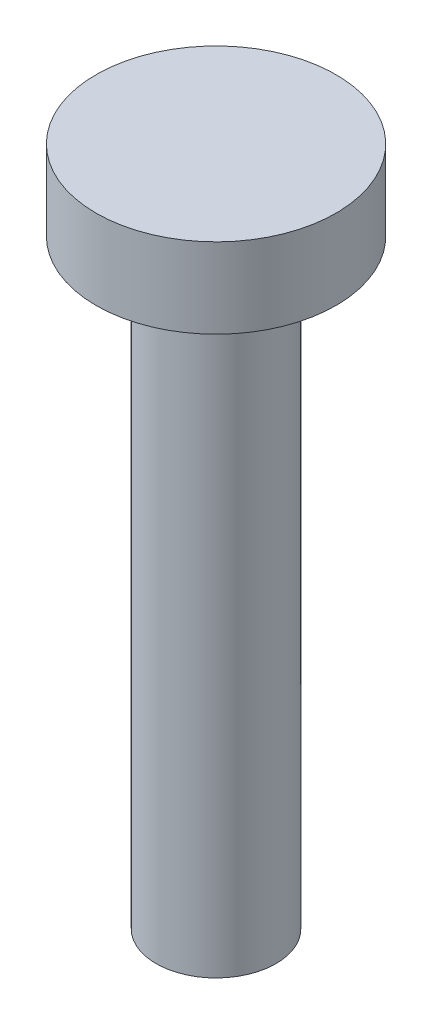
ISO-10303-21;
HEADER;
FILE_DESCRIPTION(('STEP AP214'),'2;1');
FILE_NAME('part.step','',(''),(''),'','','');
FILE_SCHEMA(('AUTOMOTIVE_DESIGN { 1 0 10303 214 1 1 1 1 }'));
ENDSEC;
DATA;
#1=APPLICATION_CONTEXT('core data for automotive mechanical design processes');
#2=APPLICATION_PROTOCOL_DEFINITION('international standard','automotive_design',2000,#1);
#3=PRODUCT_CONTEXT('',#1,'mechanical');
#4=PRODUCT('Part','Part','',(#3));
#5=PRODUCT_RELATED_PRODUCT_CATEGORY('part','',(#4));
#6=PRODUCT_DEFINITION_FORMATION('','',#4);
#7=PRODUCT_DEFINITION_CONTEXT('part definition',#1,'design');
#8=PRODUCT_DEFINITION('design','',#6,#7);
#9=PRODUCT_DEFINITION_SHAPE('','',#8);
#10=(LENGTH_UNIT() NAMED_UNIT(*) SI_UNIT(.MILLI.,.METRE.));
#11=(NAMED_UNIT(*) PLANE_ANGLE_UNIT() SI_UNIT($,.RADIAN.));
#12=(NAMED_UNIT(*) SI_UNIT($,.STERADIAN.) SOLID_ANGLE_UNIT());
#13=UNCERTAINTY_MEASURE_WITH_UNIT(LENGTH_MEASURE(1.E-05),#10,'distance_accuracy_value','');
#14=(GEOMETRIC_REPRESENTATION_CONTEXT(3) GLOBAL_UNCERTAINTY_ASSIGNED_CONTEXT((#13)) GLOBAL_UNIT_ASSIGNED_CONTEXT((#10,
#11,#12)) REPRESENTATION_CONTEXT('',''));
#15=CARTESIAN_POINT('',(0.,0.,0.));
#16=DIRECTION('',(0.,0.,1.));
#17=DIRECTION('',(1.,0.,0.));
#18=AXIS2_PLACEMENT_3D('',#15,#16,#17);
#19=CARTESIAN_POINT('',(0.,20.,0.));
#20=DIRECTION('',(0.,-1.,0.));
#21=DIRECTION('',(0.,0.,-1.));
#22=AXIS2_PLACEMENT_3D('',#19,#20,#21);
#23=CYLINDRICAL_SURFACE('',#22,30.);
#24=CARTESIAN_POINT('',(0.,20.,0.));
#25=DIRECTION('',(0.,1.,0.));
#26=DIRECTION('',(0.,0.,1.));
#27=AXIS2_PLACEMENT_3D('',#24,#25,#26);
#28=CIRCLE('',#27,30.);
#29=CARTESIAN_POINT('',(0.,20.,30.));
#30=VERTEX_POINT('',#29);
#31=EDGE_CURVE('E42',#30,#30,#28,.T.);
#32=ORIENTED_EDGE('',*,*,#31,.F.);
#33=EDGE_LOOP('',(#32));
#34=FACE_BOUND('',#33,.T.);
#35=CARTESIAN_POINT('',(0.,0.,0.));
#36=DIRECTION('',(0.,1.,0.));
#37=DIRECTION('',(0.,0.,1.));
#38=AXIS2_PLACEMENT_3D('',#35,#36,#37);
#39=CIRCLE('',#38,30.);
#40=CARTESIAN_POINT('',(0.,0.,30.));
#41=VERTEX_POINT('',#40);
#42=EDGE_CURVE('E38',#41,#41,#39,.T.);
#43=ORIENTED_EDGE('',*,*,#42,.T.);
#44=EDGE_LOOP('',(#43));
#45=FACE_BOUND('',#44,.T.);
#46=ADVANCED_FACE('F35',(#34,#45),#23,.T.);
#47=CARTESIAN_POINT('',(0.,20.,0.));
#48=DIRECTION('',(0.,1.,0.));
#49=DIRECTION('',(0.,0.,1.));
#50=AXIS2_PLACEMENT_3D('',#47,#48,#49);
#51=PLANE('',#50);
#52=ORIENTED_EDGE('',*,*,#31,.T.);
#53=EDGE_LOOP('',(#52));
#54=FACE_BOUND('',#53,.T.);
#55=ADVANCED_FACE('F59',(#54),#51,.T.);
#56=CARTESIAN_POINT('',(0.,0.,0.));
#57=DIRECTION('',(0.,1.,0.));
#58=DIRECTION('',(0.,0.,1.));
#59=AXIS2_PLACEMENT_3D('',#56,#57,#58);
#60=PLANE('',#59);
#61=CARTESIAN_POINT('',(0.,0.,0.));
#62=DIRECTION('',(0.,-1.,0.));
#63=DIRECTION('',(0.,0.,-1.));
#64=AXIS2_PLACEMENT_3D('',#61,#62,#63);
#65=CIRCLE('',#64,15.);
#66=CARTESIAN_POINT('',(0.,0.,-15.));
#67=VERTEX_POINT('',#66);
#68=EDGE_CURVE('E10',#67,#67,#65,.T.);
#69=ORIENTED_EDGE('',*,*,#68,.F.);
#70=EDGE_LOOP('',(#69));
#71=FACE_BOUND('',#70,.T.);
#72=ORIENTED_EDGE('',*,*,#42,.F.);
#73=EDGE_LOOP('',(#72));
#74=FACE_BOUND('',#73,.T.);
#75=ADVANCED_FACE('F56',(#71,#74),#60,.F.);
#76=CARTESIAN_POINT('',(0.,-150.,0.));
#77=DIRECTION('',(0.,1.,0.));
#78=DIRECTION('',(0.,0.,1.));
#79=AXIS2_PLACEMENT_3D('',#76,#77,#78);
#80=CYLINDRICAL_SURFACE('',#79,15.);
#81=CARTESIAN_POINT('',(0.,-150.,0.));
#82=DIRECTION('',(0.,-1.,0.));
#83=DIRECTION('',(0.,0.,-1.));
#84=AXIS2_PLACEMENT_3D('',#81,#82,#83);
#85=CIRCLE('',#84,15.);
#86=CARTESIAN_POINT('',(0.,-150.,-15.));
#87=VERTEX_POINT('',#86);
#88=EDGE_CURVE('E48',#87,#87,#85,.T.);
#89=ORIENTED_EDGE('',*,*,#88,.F.);
#90=EDGE_LOOP('',(#89));
#91=FACE_BOUND('',#90,.T.);
#92=ORIENTED_EDGE('',*,*,#68,.T.);
#93=EDGE_LOOP('',(#92));
#94=FACE_BOUND('',#93,.T.);
#95=ADVANCED_FACE('F58',(#91,#94),#80,.T.);
#96=CARTESIAN_POINT('',(0.,-150.,0.));
#97=DIRECTION('',(0.,-1.,0.));
#98=DIRECTION('',(0.,0.,-1.));
#99=AXIS2_PLACEMENT_3D('',#96,#97,#98);
#100=PLANE('',#99);
#101=ORIENTED_EDGE('',*,*,#88,.T.);
#102=EDGE_LOOP('',(#101));
#103=FACE_BOUND('',#102,.T.);
#104=ADVANCED_FACE('F65',(#103),#100,.T.);
#105=CLOSED_SHELL('',(#46,#55,#75,#95,#104));
#106=MANIFOLD_SOLID_BREP('B2',#105);
#107=ADVANCED_BREP_SHAPE_REPRESENTATION('',(#18,#106),#14);
#108=SHAPE_DEFINITION_REPRESENTATION(#9,#107);
ENDSEC;
END-ISO-10303-21;
